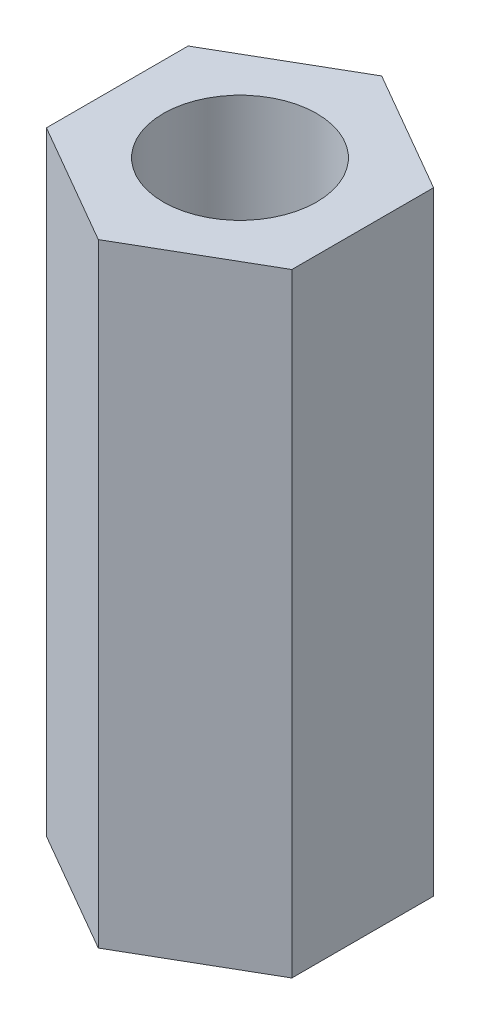
ISO-10303-21;
HEADER;
FILE_DESCRIPTION(('STEP AP214'),'2;1');
FILE_NAME('part.step','',(''),(''),'','','');
FILE_SCHEMA(('AUTOMOTIVE_DESIGN { 1 0 10303 214 1 1 1 1 }'));
ENDSEC;
DATA;
#1=APPLICATION_CONTEXT('core data for automotive mechanical design processes');
#2=APPLICATION_PROTOCOL_DEFINITION('international standard','automotive_design',2000,#1);
#3=PRODUCT_CONTEXT('',#1,'mechanical');
#4=PRODUCT('Part','Part','',(#3));
#5=PRODUCT_RELATED_PRODUCT_CATEGORY('part','',(#4));
#6=PRODUCT_DEFINITION_FORMATION('','',#4);
#7=PRODUCT_DEFINITION_CONTEXT('part definition',#1,'design');
#8=PRODUCT_DEFINITION('design','',#6,#7);
#9=PRODUCT_DEFINITION_SHAPE('','',#8);
#10=(LENGTH_UNIT() NAMED_UNIT(*) SI_UNIT(.MILLI.,.METRE.));
#11=(NAMED_UNIT(*) PLANE_ANGLE_UNIT() SI_UNIT($,.RADIAN.));
#12=(NAMED_UNIT(*) SI_UNIT($,.STERADIAN.) SOLID_ANGLE_UNIT());
#13=UNCERTAINTY_MEASURE_WITH_UNIT(LENGTH_MEASURE(1.E-05),#10,'distance_accuracy_value','');
#14=(GEOMETRIC_REPRESENTATION_CONTEXT(3) GLOBAL_UNCERTAINTY_ASSIGNED_CONTEXT((#13)) GLOBAL_UNIT_ASSIGNED_CONTEXT((#10,
#11,#12)) REPRESENTATION_CONTEXT('',''));
#15=CARTESIAN_POINT('',(0.,0.,0.));
#16=DIRECTION('',(0.,0.,1.));
#17=DIRECTION('',(1.,0.,0.));
#18=AXIS2_PLACEMENT_3D('',#15,#16,#17);
#19=CARTESIAN_POINT('',(0.,20.,0.));
#20=DIRECTION('',(0.,1.,0.));
#21=DIRECTION('',(0.,0.,1.));
#22=AXIS2_PLACEMENT_3D('',#19,#20,#21);
#23=PLANE('',#22);
#24=DIRECTION('',(-0.866025403784439,0.,-0.5));
#25=VECTOR('',#24,1.);
#26=CARTESIAN_POINT('',(4.,20.,-2.3094010767585));
#27=LINE('',#26,#25);
#28=CARTESIAN_POINT('',(4.,20.,-2.3094010767585));
#29=VERTEX_POINT('',#28);
#30=CARTESIAN_POINT('',(0.,20.,-4.618802153517));
#31=VERTEX_POINT('',#30);
#32=EDGE_CURVE('E131',#29,#31,#27,.T.);
#33=ORIENTED_EDGE('',*,*,#32,.T.);
#34=DIRECTION('',(-0.866025403784439,0.,0.5));
#35=VECTOR('',#34,1.);
#36=CARTESIAN_POINT('',(0.,20.,-4.618802153517));
#37=LINE('',#36,#35);
#38=CARTESIAN_POINT('',(-4.,20.,-2.3094010767585));
#39=VERTEX_POINT('',#38);
#40=EDGE_CURVE('E89',#31,#39,#37,.T.);
#41=ORIENTED_EDGE('',*,*,#40,.T.);
#42=DIRECTION('',(0.,0.,1.));
#43=VECTOR('',#42,1.);
#44=CARTESIAN_POINT('',(-4.,20.,-2.3094010767585));
#45=LINE('',#44,#43);
#46=CARTESIAN_POINT('',(-4.,20.,2.3094010767585));
#47=VERTEX_POINT('',#46);
#48=EDGE_CURVE('E102',#39,#47,#45,.T.);
#49=ORIENTED_EDGE('',*,*,#48,.T.);
#50=DIRECTION('',(0.866025403784439,0.,0.5));
#51=VECTOR('',#50,1.);
#52=CARTESIAN_POINT('',(-4.,20.,2.3094010767585));
#53=LINE('',#52,#51);
#54=CARTESIAN_POINT('',(0.,20.,4.61880215351701));
#55=VERTEX_POINT('',#54);
#56=EDGE_CURVE('E96',#47,#55,#53,.T.);
#57=ORIENTED_EDGE('',*,*,#56,.T.);
#58=DIRECTION('',(0.866025403784439,0.,-0.5));
#59=VECTOR('',#58,1.);
#60=CARTESIAN_POINT('',(0.,20.,4.61880215351701));
#61=LINE('',#60,#59);
#62=CARTESIAN_POINT('',(4.,20.,2.3094010767585));
#63=VERTEX_POINT('',#62);
#64=EDGE_CURVE('E100',#55,#63,#61,.T.);
#65=ORIENTED_EDGE('',*,*,#64,.T.);
#66=DIRECTION('',(0.,0.,-1.));
#67=VECTOR('',#66,1.);
#68=CARTESIAN_POINT('',(4.,20.,2.3094010767585));
#69=LINE('',#68,#67);
#70=EDGE_CURVE('E52',#63,#29,#69,.T.);
#71=ORIENTED_EDGE('',*,*,#70,.T.);
#72=EDGE_LOOP('',(#33,#41,#49,#57,#65,#71));
#73=FACE_BOUND('',#72,.T.);
#74=CARTESIAN_POINT('',(0.,20.,0.));
#75=DIRECTION('',(0.,1.,0.));
#76=DIRECTION('',(0.,0.,1.));
#77=AXIS2_PLACEMENT_3D('',#74,#75,#76);
#78=CIRCLE('',#77,2.5);
#79=CARTESIAN_POINT('',(0.,20.,2.5));
#80=VERTEX_POINT('',#79);
#81=EDGE_CURVE('E124',#80,#80,#78,.T.);
#82=ORIENTED_EDGE('',*,*,#81,.F.);
#83=EDGE_LOOP('',(#82));
#84=FACE_BOUND('',#83,.T.);
#85=ADVANCED_FACE('F35',(#73,#84),#23,.T.);
#86=CARTESIAN_POINT('',(0.,0.,0.));
#87=DIRECTION('',(0.,1.,0.));
#88=DIRECTION('',(0.,0.,1.));
#89=AXIS2_PLACEMENT_3D('',#86,#87,#88);
#90=PLANE('',#89);
#91=DIRECTION('',(-0.866025403784439,0.,-0.5));
#92=VECTOR('',#91,1.);
#93=CARTESIAN_POINT('',(4.,0.,-2.3094010767585));
#94=LINE('',#93,#92);
#95=CARTESIAN_POINT('',(4.,0.,-2.3094010767585));
#96=VERTEX_POINT('',#95);
#97=CARTESIAN_POINT('',(0.,0.,-4.618802153517));
#98=VERTEX_POINT('',#97);
#99=EDGE_CURVE('E120',#96,#98,#94,.T.);
#100=ORIENTED_EDGE('',*,*,#99,.F.);
#101=DIRECTION('',(0.,0.,-1.));
#102=VECTOR('',#101,1.);
#103=CARTESIAN_POINT('',(4.,0.,2.3094010767585));
#104=LINE('',#103,#102);
#105=CARTESIAN_POINT('',(4.,0.,2.3094010767585));
#106=VERTEX_POINT('',#105);
#107=EDGE_CURVE('E81',#106,#96,#104,.T.);
#108=ORIENTED_EDGE('',*,*,#107,.F.);
#109=DIRECTION('',(0.866025403784439,0.,-0.5));
#110=VECTOR('',#109,1.);
#111=CARTESIAN_POINT('',(0.,0.,4.61880215351701));
#112=LINE('',#111,#110);
#113=CARTESIAN_POINT('',(0.,0.,4.61880215351701));
#114=VERTEX_POINT('',#113);
#115=EDGE_CURVE('E75',#114,#106,#112,.T.);
#116=ORIENTED_EDGE('',*,*,#115,.F.);
#117=DIRECTION('',(0.866025403784439,0.,0.5));
#118=VECTOR('',#117,1.);
#119=CARTESIAN_POINT('',(-4.,0.,2.3094010767585));
#120=LINE('',#119,#118);
#121=CARTESIAN_POINT('',(-4.,0.,2.3094010767585));
#122=VERTEX_POINT('',#121);
#123=EDGE_CURVE('E110',#122,#114,#120,.T.);
#124=ORIENTED_EDGE('',*,*,#123,.F.);
#125=DIRECTION('',(0.,0.,1.));
#126=VECTOR('',#125,1.);
#127=CARTESIAN_POINT('',(-4.,0.,-2.3094010767585));
#128=LINE('',#127,#126);
#129=CARTESIAN_POINT('',(-4.,0.,-2.3094010767585));
#130=VERTEX_POINT('',#129);
#131=EDGE_CURVE('E126',#130,#122,#128,.T.);
#132=ORIENTED_EDGE('',*,*,#131,.F.);
#133=DIRECTION('',(-0.866025403784439,0.,0.5));
#134=VECTOR('',#133,1.);
#135=CARTESIAN_POINT('',(0.,0.,-4.618802153517));
#136=LINE('',#135,#134);
#137=EDGE_CURVE('E123',#98,#130,#136,.T.);
#138=ORIENTED_EDGE('',*,*,#137,.F.);
#139=EDGE_LOOP('',(#100,#108,#116,#124,#132,#138));
#140=FACE_BOUND('',#139,.T.);
#141=CARTESIAN_POINT('',(0.,0.,0.));
#142=DIRECTION('',(0.,1.,0.));
#143=DIRECTION('',(0.,0.,1.));
#144=AXIS2_PLACEMENT_3D('',#141,#142,#143);
#145=CIRCLE('',#144,2.5);
#146=CARTESIAN_POINT('',(0.,0.,2.5));
#147=VERTEX_POINT('',#146);
#148=EDGE_CURVE('E224',#147,#147,#145,.T.);
#149=ORIENTED_EDGE('',*,*,#148,.T.);
#150=EDGE_LOOP('',(#149));
#151=FACE_BOUND('',#150,.T.);
#152=ADVANCED_FACE('F140',(#140,#151),#90,.F.);
#153=CARTESIAN_POINT('',(4.,20.,-2.3094010767585));
#154=DIRECTION('',(-0.5,0.,0.866025403784439));
#155=DIRECTION('',(0.866025403784439,0.,0.5));
#156=AXIS2_PLACEMENT_3D('',#153,#154,#155);
#157=PLANE('',#156);
#158=ORIENTED_EDGE('',*,*,#99,.T.);
#159=DIRECTION('',(0.,-1.,0.));
#160=VECTOR('',#159,1.);
#161=CARTESIAN_POINT('',(0.,20.,-4.618802153517));
#162=LINE('',#161,#160);
#163=EDGE_CURVE('E11',#31,#98,#162,.T.);
#164=ORIENTED_EDGE('',*,*,#163,.F.);
#165=ORIENTED_EDGE('',*,*,#32,.F.);
#166=DIRECTION('',(0.,-1.,0.));
#167=VECTOR('',#166,1.);
#168=CARTESIAN_POINT('',(4.,20.,-2.3094010767585));
#169=LINE('',#168,#167);
#170=EDGE_CURVE('E116',#29,#96,#169,.T.);
#171=ORIENTED_EDGE('',*,*,#170,.T.);
#172=EDGE_LOOP('',(#158,#164,#165,#171));
#173=FACE_BOUND('',#172,.T.);
#174=ADVANCED_FACE('F37',(#173),#157,.F.);
#175=CARTESIAN_POINT('',(0.,20.,-4.618802153517));
#176=DIRECTION('',(0.5,0.,0.866025403784439));
#177=DIRECTION('',(0.866025403784439,0.,-0.5));
#178=AXIS2_PLACEMENT_3D('',#175,#176,#177);
#179=PLANE('',#178);
#180=ORIENTED_EDGE('',*,*,#137,.T.);
#181=DIRECTION('',(0.,-1.,0.));
#182=VECTOR('',#181,1.);
#183=CARTESIAN_POINT('',(-4.,20.,-2.3094010767585));
#184=LINE('',#183,#182);
#185=EDGE_CURVE('E44',#39,#130,#184,.T.);
#186=ORIENTED_EDGE('',*,*,#185,.F.);
#187=ORIENTED_EDGE('',*,*,#40,.F.);
#188=ORIENTED_EDGE('',*,*,#163,.T.);
#189=EDGE_LOOP('',(#180,#186,#187,#188));
#190=FACE_BOUND('',#189,.T.);
#191=ADVANCED_FACE('F165',(#190),#179,.F.);
#192=CARTESIAN_POINT('',(-4.,20.,-2.3094010767585));
#193=DIRECTION('',(1.,0.,0.));
#194=DIRECTION('',(0.,0.,-1.));
#195=AXIS2_PLACEMENT_3D('',#192,#193,#194);
#196=PLANE('',#195);
#197=ORIENTED_EDGE('',*,*,#131,.T.);
#198=DIRECTION('',(0.,-1.,0.));
#199=VECTOR('',#198,1.);
#200=CARTESIAN_POINT('',(-4.,20.,2.3094010767585));
#201=LINE('',#200,#199);
#202=EDGE_CURVE('E111',#47,#122,#201,.T.);
#203=ORIENTED_EDGE('',*,*,#202,.F.);
#204=ORIENTED_EDGE('',*,*,#48,.F.);
#205=ORIENTED_EDGE('',*,*,#185,.T.);
#206=EDGE_LOOP('',(#197,#203,#204,#205));
#207=FACE_BOUND('',#206,.T.);
#208=ADVANCED_FACE('F137',(#207),#196,.F.);
#209=CARTESIAN_POINT('',(-4.,20.,2.3094010767585));
#210=DIRECTION('',(0.5,0.,-0.866025403784439));
#211=DIRECTION('',(-0.866025403784439,0.,-0.5));
#212=AXIS2_PLACEMENT_3D('',#209,#210,#211);
#213=PLANE('',#212);
#214=ORIENTED_EDGE('',*,*,#123,.T.);
#215=DIRECTION('',(0.,-1.,0.));
#216=VECTOR('',#215,1.);
#217=CARTESIAN_POINT('',(0.,20.,4.61880215351701));
#218=LINE('',#217,#216);
#219=EDGE_CURVE('E107',#55,#114,#218,.T.);
#220=ORIENTED_EDGE('',*,*,#219,.F.);
#221=ORIENTED_EDGE('',*,*,#56,.F.);
#222=ORIENTED_EDGE('',*,*,#202,.T.);
#223=EDGE_LOOP('',(#214,#220,#221,#222));
#224=FACE_BOUND('',#223,.T.);
#225=ADVANCED_FACE('F108',(#224),#213,.F.);
#226=CARTESIAN_POINT('',(0.,20.,4.61880215351701));
#227=DIRECTION('',(-0.5,0.,-0.866025403784439));
#228=DIRECTION('',(-0.866025403784439,0.,0.5));
#229=AXIS2_PLACEMENT_3D('',#226,#227,#228);
#230=PLANE('',#229);
#231=ORIENTED_EDGE('',*,*,#115,.T.);
#232=DIRECTION('',(0.,-1.,0.));
#233=VECTOR('',#232,1.);
#234=CARTESIAN_POINT('',(4.,20.,2.3094010767585));
#235=LINE('',#234,#233);
#236=EDGE_CURVE('E112',#63,#106,#235,.T.);
#237=ORIENTED_EDGE('',*,*,#236,.F.);
#238=ORIENTED_EDGE('',*,*,#64,.F.);
#239=ORIENTED_EDGE('',*,*,#219,.T.);
#240=EDGE_LOOP('',(#231,#237,#238,#239));
#241=FACE_BOUND('',#240,.T.);
#242=ADVANCED_FACE('F114',(#241),#230,.F.);
#243=CARTESIAN_POINT('',(4.,20.,2.3094010767585));
#244=DIRECTION('',(-1.,0.,0.));
#245=DIRECTION('',(0.,0.,1.));
#246=AXIS2_PLACEMENT_3D('',#243,#244,#245);
#247=PLANE('',#246);
#248=ORIENTED_EDGE('',*,*,#107,.T.);
#249=ORIENTED_EDGE('',*,*,#170,.F.);
#250=ORIENTED_EDGE('',*,*,#70,.F.);
#251=ORIENTED_EDGE('',*,*,#236,.T.);
#252=EDGE_LOOP('',(#248,#249,#250,#251));
#253=FACE_BOUND('',#252,.T.);
#254=ADVANCED_FACE('F145',(#253),#247,.F.);
#255=CARTESIAN_POINT('',(0.,20.,0.));
#256=DIRECTION('',(0.,-1.,0.));
#257=DIRECTION('',(0.,0.,-1.));
#258=AXIS2_PLACEMENT_3D('',#255,#256,#257);
#259=CYLINDRICAL_SURFACE('',#258,2.5);
#260=ORIENTED_EDGE('',*,*,#81,.T.);
#261=EDGE_LOOP('',(#260));
#262=FACE_BOUND('',#261,.T.);
#263=ORIENTED_EDGE('',*,*,#148,.F.);
#264=EDGE_LOOP('',(#263));
#265=FACE_BOUND('',#264,.T.);
#266=ADVANCED_FACE('F147',(#262,#265),#259,.F.);
#267=CLOSED_SHELL('',(#85,#152,#174,#191,#208,#225,#242,#254,#266));
#268=MANIFOLD_SOLID_BREP('B2',#267);
#269=ADVANCED_BREP_SHAPE_REPRESENTATION('',(#18,#268),#14);
#270=SHAPE_DEFINITION_REPRESENTATION(#9,#269);
ENDSEC;
END-ISO-10303-21;
